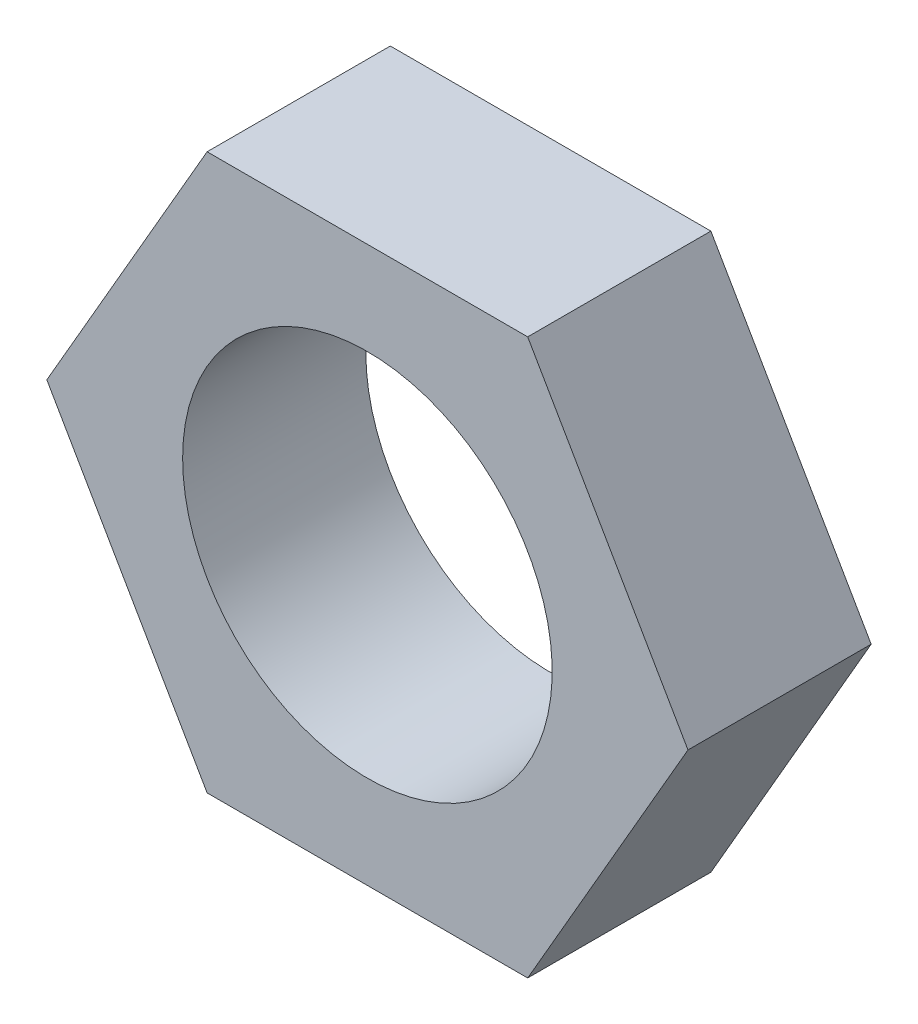
ISO-10303-21;
HEADER;
FILE_DESCRIPTION(('STEP AP214'),'2;1');
FILE_NAME('part.step','',(''),(''),'','','');
FILE_SCHEMA(('AUTOMOTIVE_DESIGN { 1 0 10303 214 1 1 1 1 }'));
ENDSEC;
DATA;
#1=APPLICATION_CONTEXT('core data for automotive mechanical design processes');
#2=APPLICATION_PROTOCOL_DEFINITION('international standard','automotive_design',2000,#1);
#3=PRODUCT_CONTEXT('',#1,'mechanical');
#4=PRODUCT('Part','Part','',(#3));
#5=PRODUCT_RELATED_PRODUCT_CATEGORY('part','',(#4));
#6=PRODUCT_DEFINITION_FORMATION('','',#4);
#7=PRODUCT_DEFINITION_CONTEXT('part definition',#1,'design');
#8=PRODUCT_DEFINITION('design','',#6,#7);
#9=PRODUCT_DEFINITION_SHAPE('','',#8);
#10=(LENGTH_UNIT() NAMED_UNIT(*) SI_UNIT(.MILLI.,.METRE.));
#11=(NAMED_UNIT(*) PLANE_ANGLE_UNIT() SI_UNIT($,.RADIAN.));
#12=(NAMED_UNIT(*) SI_UNIT($,.STERADIAN.) SOLID_ANGLE_UNIT());
#13=UNCERTAINTY_MEASURE_WITH_UNIT(LENGTH_MEASURE(1.E-05),#10,'distance_accuracy_value','');
#14=(GEOMETRIC_REPRESENTATION_CONTEXT(3) GLOBAL_UNCERTAINTY_ASSIGNED_CONTEXT((#13)) GLOBAL_UNIT_ASSIGNED_CONTEXT((#10,
#11,#12)) REPRESENTATION_CONTEXT('',''));
#15=CARTESIAN_POINT('',(0.,0.,0.));
#16=DIRECTION('',(0.,0.,1.));
#17=DIRECTION('',(1.,0.,0.));
#18=AXIS2_PLACEMENT_3D('',#15,#16,#17);
#19=CARTESIAN_POINT('',(11.1125,-19.2474145991092,12.7));
#20=DIRECTION('',(-0.866025403784439,0.5,0.));
#21=DIRECTION('',(-0.5,-0.866025403784439,0.));
#22=AXIS2_PLACEMENT_3D('',#19,#20,#21);
#23=PLANE('',#22);
#24=DIRECTION('',(0.5,0.866025403784439,0.));
#25=VECTOR('',#24,1.);
#26=CARTESIAN_POINT('',(11.1125,-19.2474145991092,0.));
#27=LINE('',#26,#25);
#28=CARTESIAN_POINT('',(11.1125,-19.2474145991092,0.));
#29=VERTEX_POINT('',#28);
#30=CARTESIAN_POINT('',(22.225,0.,0.));
#31=VERTEX_POINT('',#30);
#32=EDGE_CURVE('E117',#29,#31,#27,.T.);
#33=ORIENTED_EDGE('',*,*,#32,.T.);
#34=DIRECTION('',(0.,0.,-1.));
#35=VECTOR('',#34,1.);
#36=CARTESIAN_POINT('',(22.225,0.,12.7));
#37=LINE('',#36,#35);
#38=CARTESIAN_POINT('',(22.225,0.,12.7));
#39=VERTEX_POINT('',#38);
#40=EDGE_CURVE('E11',#39,#31,#37,.T.);
#41=ORIENTED_EDGE('',*,*,#40,.F.);
#42=DIRECTION('',(0.5,0.866025403784439,0.));
#43=VECTOR('',#42,1.);
#44=CARTESIAN_POINT('',(11.1125,-19.2474145991092,12.7));
#45=LINE('',#44,#43);
#46=CARTESIAN_POINT('',(11.1125,-19.2474145991092,12.7));
#47=VERTEX_POINT('',#46);
#48=EDGE_CURVE('E128',#47,#39,#45,.T.);
#49=ORIENTED_EDGE('',*,*,#48,.F.);
#50=DIRECTION('',(0.,0.,-1.));
#51=VECTOR('',#50,1.);
#52=CARTESIAN_POINT('',(11.1125,-19.2474145991092,12.7));
#53=LINE('',#52,#51);
#54=EDGE_CURVE('E113',#47,#29,#53,.T.);
#55=ORIENTED_EDGE('',*,*,#54,.T.);
#56=EDGE_LOOP('',(#33,#41,#49,#55));
#57=FACE_BOUND('',#56,.T.);
#58=ADVANCED_FACE('F33',(#57),#23,.F.);
#59=CARTESIAN_POINT('',(22.225,0.,12.7));
#60=DIRECTION('',(-0.866025403784439,-0.5,0.));
#61=DIRECTION('',(0.5,-0.866025403784439,0.));
#62=AXIS2_PLACEMENT_3D('',#59,#60,#61);
#63=PLANE('',#62);
#64=DIRECTION('',(-0.5,0.866025403784438,0.));
#65=VECTOR('',#64,1.);
#66=CARTESIAN_POINT('',(22.225,0.,0.));
#67=LINE('',#66,#65);
#68=CARTESIAN_POINT('',(11.1125,19.2474145991091,0.));
#69=VERTEX_POINT('',#68);
#70=EDGE_CURVE('E120',#31,#69,#67,.T.);
#71=ORIENTED_EDGE('',*,*,#70,.T.);
#72=DIRECTION('',(0.,0.,-1.));
#73=VECTOR('',#72,1.);
#74=CARTESIAN_POINT('',(11.1125,19.2474145991091,12.7));
#75=LINE('',#74,#73);
#76=CARTESIAN_POINT('',(11.1125,19.2474145991091,12.7));
#77=VERTEX_POINT('',#76);
#78=EDGE_CURVE('E41',#77,#69,#75,.T.);
#79=ORIENTED_EDGE('',*,*,#78,.F.);
#80=DIRECTION('',(-0.5,0.866025403784438,0.));
#81=VECTOR('',#80,1.);
#82=CARTESIAN_POINT('',(22.225,0.,12.7));
#83=LINE('',#82,#81);
#84=EDGE_CURVE('E86',#39,#77,#83,.T.);
#85=ORIENTED_EDGE('',*,*,#84,.F.);
#86=ORIENTED_EDGE('',*,*,#40,.T.);
#87=EDGE_LOOP('',(#71,#79,#85,#86));
#88=FACE_BOUND('',#87,.T.);
#89=ADVANCED_FACE('F153',(#88),#63,.F.);
#90=CARTESIAN_POINT('',(11.1125,19.2474145991091,12.7));
#91=DIRECTION('',(0.,-1.,0.));
#92=DIRECTION('',(0.,0.,-1.));
#93=AXIS2_PLACEMENT_3D('',#90,#91,#92);
#94=PLANE('',#93);
#95=DIRECTION('',(-1.,0.,0.));
#96=VECTOR('',#95,1.);
#97=CARTESIAN_POINT('',(11.1125,19.2474145991091,0.));
#98=LINE('',#97,#96);
#99=CARTESIAN_POINT('',(-11.1125,19.2474145991091,0.));
#100=VERTEX_POINT('',#99);
#101=EDGE_CURVE('E123',#69,#100,#98,.T.);
#102=ORIENTED_EDGE('',*,*,#101,.T.);
#103=DIRECTION('',(0.,0.,-1.));
#104=VECTOR('',#103,1.);
#105=CARTESIAN_POINT('',(-11.1125,19.2474145991091,12.7));
#106=LINE('',#105,#104);
#107=CARTESIAN_POINT('',(-11.1125,19.2474145991091,12.7));
#108=VERTEX_POINT('',#107);
#109=EDGE_CURVE('E108',#108,#100,#106,.T.);
#110=ORIENTED_EDGE('',*,*,#109,.F.);
#111=DIRECTION('',(-1.,0.,0.));
#112=VECTOR('',#111,1.);
#113=CARTESIAN_POINT('',(11.1125,19.2474145991091,12.7));
#114=LINE('',#113,#112);
#115=EDGE_CURVE('E99',#77,#108,#114,.T.);
#116=ORIENTED_EDGE('',*,*,#115,.F.);
#117=ORIENTED_EDGE('',*,*,#78,.T.);
#118=EDGE_LOOP('',(#102,#110,#116,#117));
#119=FACE_BOUND('',#118,.T.);
#120=ADVANCED_FACE('F134',(#119),#94,.F.);
#121=CARTESIAN_POINT('',(-11.1125,19.2474145991091,12.7));
#122=DIRECTION('',(0.866025403784439,-0.5,0.));
#123=DIRECTION('',(0.5,0.866025403784439,0.));
#124=AXIS2_PLACEMENT_3D('',#121,#122,#123);
#125=PLANE('',#124);
#126=DIRECTION('',(-0.5,-0.866025403784439,0.));
#127=VECTOR('',#126,1.);
#128=CARTESIAN_POINT('',(-11.1125,19.2474145991091,0.));
#129=LINE('',#128,#127);
#130=CARTESIAN_POINT('',(-22.225,0.,0.));
#131=VERTEX_POINT('',#130);
#132=EDGE_CURVE('E107',#100,#131,#129,.T.);
#133=ORIENTED_EDGE('',*,*,#132,.T.);
#134=DIRECTION('',(0.,0.,-1.));
#135=VECTOR('',#134,1.);
#136=CARTESIAN_POINT('',(-22.225,0.,12.7));
#137=LINE('',#136,#135);
#138=CARTESIAN_POINT('',(-22.225,0.,12.7));
#139=VERTEX_POINT('',#138);
#140=EDGE_CURVE('E104',#139,#131,#137,.T.);
#141=ORIENTED_EDGE('',*,*,#140,.F.);
#142=DIRECTION('',(-0.5,-0.866025403784439,0.));
#143=VECTOR('',#142,1.);
#144=CARTESIAN_POINT('',(-11.1125,19.2474145991091,12.7));
#145=LINE('',#144,#143);
#146=EDGE_CURVE('E93',#108,#139,#145,.T.);
#147=ORIENTED_EDGE('',*,*,#146,.F.);
#148=ORIENTED_EDGE('',*,*,#109,.T.);
#149=EDGE_LOOP('',(#133,#141,#147,#148));
#150=FACE_BOUND('',#149,.T.);
#151=ADVANCED_FACE('F105',(#150),#125,.F.);
#152=CARTESIAN_POINT('',(-22.225,0.,12.7));
#153=DIRECTION('',(0.866025403784439,0.5,0.));
#154=DIRECTION('',(-0.5,0.866025403784439,0.));
#155=AXIS2_PLACEMENT_3D('',#152,#153,#154);
#156=PLANE('',#155);
#157=DIRECTION('',(0.5,-0.866025403784439,0.));
#158=VECTOR('',#157,1.);
#159=CARTESIAN_POINT('',(-22.225,0.,0.));
#160=LINE('',#159,#158);
#161=CARTESIAN_POINT('',(-11.1125,-19.2474145991091,0.));
#162=VERTEX_POINT('',#161);
#163=EDGE_CURVE('E72',#131,#162,#160,.T.);
#164=ORIENTED_EDGE('',*,*,#163,.T.);
#165=DIRECTION('',(0.,0.,-1.));
#166=VECTOR('',#165,1.);
#167=CARTESIAN_POINT('',(-11.1125,-19.2474145991091,12.7));
#168=LINE('',#167,#166);
#169=CARTESIAN_POINT('',(-11.1125,-19.2474145991091,12.7));
#170=VERTEX_POINT('',#169);
#171=EDGE_CURVE('E109',#170,#162,#168,.T.);
#172=ORIENTED_EDGE('',*,*,#171,.F.);
#173=DIRECTION('',(0.5,-0.866025403784439,0.));
#174=VECTOR('',#173,1.);
#175=CARTESIAN_POINT('',(-22.225,0.,12.7));
#176=LINE('',#175,#174);
#177=EDGE_CURVE('E97',#139,#170,#176,.T.);
#178=ORIENTED_EDGE('',*,*,#177,.F.);
#179=ORIENTED_EDGE('',*,*,#140,.T.);
#180=EDGE_LOOP('',(#164,#172,#178,#179));
#181=FACE_BOUND('',#180,.T.);
#182=ADVANCED_FACE('F111',(#181),#156,.F.);
#183=CARTESIAN_POINT('',(-11.1125,-19.2474145991091,12.7));
#184=DIRECTION('',(0.,1.,0.));
#185=DIRECTION('',(-1.,0.,0.));
#186=AXIS2_PLACEMENT_3D('',#183,#184,#185);
#187=PLANE('',#186);
#188=DIRECTION('',(1.,0.,0.));
#189=VECTOR('',#188,1.);
#190=CARTESIAN_POINT('',(-11.1125,-19.2474145991091,0.));
#191=LINE('',#190,#189);
#192=EDGE_CURVE('E78',#162,#29,#191,.T.);
#193=ORIENTED_EDGE('',*,*,#192,.T.);
#194=ORIENTED_EDGE('',*,*,#54,.F.);
#195=DIRECTION('',(1.,0.,0.));
#196=VECTOR('',#195,1.);
#197=CARTESIAN_POINT('',(-11.1125,-19.2474145991091,12.7));
#198=LINE('',#197,#196);
#199=EDGE_CURVE('E49',#170,#47,#198,.T.);
#200=ORIENTED_EDGE('',*,*,#199,.F.);
#201=ORIENTED_EDGE('',*,*,#171,.T.);
#202=EDGE_LOOP('',(#193,#194,#200,#201));
#203=FACE_BOUND('',#202,.T.);
#204=ADVANCED_FACE('F141',(#203),#187,.F.);
#205=CARTESIAN_POINT('',(22.225,0.,12.7));
#206=DIRECTION('',(0.,0.,1.));
#207=DIRECTION('',(1.,0.,0.));
#208=AXIS2_PLACEMENT_3D('',#205,#206,#207);
#209=PLANE('',#208);
#210=CARTESIAN_POINT('',(0.,0.,12.7));
#211=DIRECTION('',(0.,0.,-1.));
#212=DIRECTION('',(-1.,0.,0.));
#213=AXIS2_PLACEMENT_3D('',#210,#211,#212);
#214=CIRCLE('',#213,12.8107312113805);
#215=CARTESIAN_POINT('',(-12.8107312113805,0.,12.7));
#216=VERTEX_POINT('',#215);
#217=EDGE_CURVE('E121',#216,#216,#214,.T.);
#218=ORIENTED_EDGE('',*,*,#217,.T.);
#219=EDGE_LOOP('',(#218));
#220=FACE_BOUND('',#219,.T.);
#221=ORIENTED_EDGE('',*,*,#48,.T.);
#222=ORIENTED_EDGE('',*,*,#84,.T.);
#223=ORIENTED_EDGE('',*,*,#115,.T.);
#224=ORIENTED_EDGE('',*,*,#146,.T.);
#225=ORIENTED_EDGE('',*,*,#177,.T.);
#226=ORIENTED_EDGE('',*,*,#199,.T.);
#227=EDGE_LOOP('',(#221,#222,#223,#224,#225,#226));
#228=FACE_BOUND('',#227,.T.);
#229=ADVANCED_FACE('F95',(#220,#228),#209,.T.);
#230=CARTESIAN_POINT('',(22.225,0.,0.));
#231=DIRECTION('',(0.,0.,1.));
#232=DIRECTION('',(1.,0.,0.));
#233=AXIS2_PLACEMENT_3D('',#230,#231,#232);
#234=PLANE('',#233);
#235=CARTESIAN_POINT('',(0.,0.,0.));
#236=DIRECTION('',(0.,0.,-1.));
#237=DIRECTION('',(-1.,0.,0.));
#238=AXIS2_PLACEMENT_3D('',#235,#236,#237);
#239=CIRCLE('',#238,12.8107312113805);
#240=CARTESIAN_POINT('',(-12.8107312113805,0.,0.));
#241=VERTEX_POINT('',#240);
#242=EDGE_CURVE('E208',#241,#241,#239,.T.);
#243=ORIENTED_EDGE('',*,*,#242,.F.);
#244=EDGE_LOOP('',(#243));
#245=FACE_BOUND('',#244,.T.);
#246=ORIENTED_EDGE('',*,*,#32,.F.);
#247=ORIENTED_EDGE('',*,*,#192,.F.);
#248=ORIENTED_EDGE('',*,*,#163,.F.);
#249=ORIENTED_EDGE('',*,*,#132,.F.);
#250=ORIENTED_EDGE('',*,*,#101,.F.);
#251=ORIENTED_EDGE('',*,*,#70,.F.);
#252=EDGE_LOOP('',(#246,#247,#248,#249,#250,#251));
#253=FACE_BOUND('',#252,.T.);
#254=ADVANCED_FACE('F137',(#245,#253),#234,.F.);
#255=CARTESIAN_POINT('',(0.,0.,12.7));
#256=DIRECTION('',(0.,0.,-1.));
#257=DIRECTION('',(-1.,0.,0.));
#258=AXIS2_PLACEMENT_3D('',#255,#256,#257);
#259=CYLINDRICAL_SURFACE('',#258,12.8107312113805);
#260=ORIENTED_EDGE('',*,*,#217,.F.);
#261=EDGE_LOOP('',(#260));
#262=FACE_BOUND('',#261,.T.);
#263=ORIENTED_EDGE('',*,*,#242,.T.);
#264=EDGE_LOOP('',(#263));
#265=FACE_BOUND('',#264,.T.);
#266=ADVANCED_FACE('F190',(#262,#265),#259,.F.);
#267=CLOSED_SHELL('',(#58,#89,#120,#151,#182,#204,#229,#254,#266));
#268=MANIFOLD_SOLID_BREP('B2',#267);
#269=ADVANCED_BREP_SHAPE_REPRESENTATION('',(#18,#268),#14);
#270=SHAPE_DEFINITION_REPRESENTATION(#9,#269);
ENDSEC;
END-ISO-10303-21;
